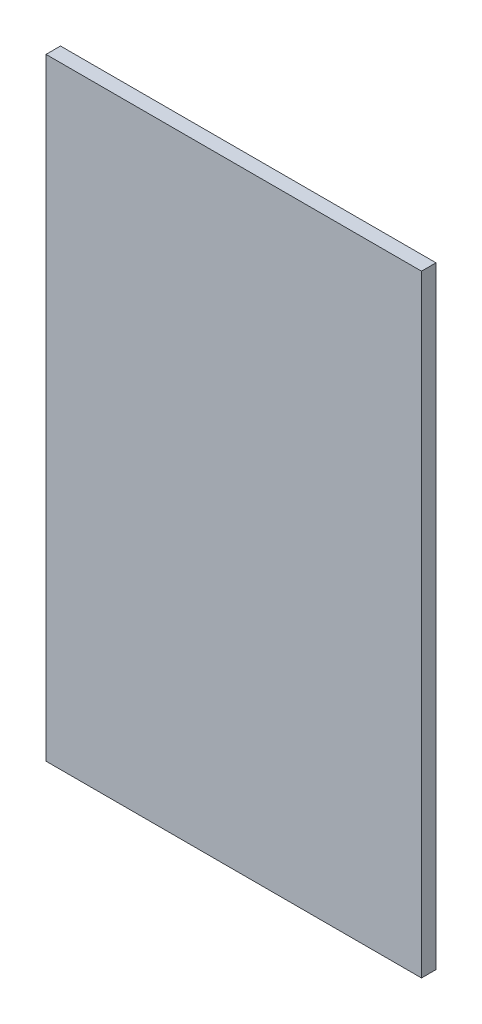
ISO-10303-21;
HEADER;
FILE_DESCRIPTION(('STEP AP214'),'2;1');
FILE_NAME('part.step','',(''),(''),'','','');
FILE_SCHEMA(('AUTOMOTIVE_DESIGN { 1 0 10303 214 1 1 1 1 }'));
ENDSEC;
DATA;
#1=APPLICATION_CONTEXT('core data for automotive mechanical design processes');
#2=APPLICATION_PROTOCOL_DEFINITION('international standard','automotive_design',2000,#1);
#3=PRODUCT_CONTEXT('',#1,'mechanical');
#4=PRODUCT('Part','Part','',(#3));
#5=PRODUCT_RELATED_PRODUCT_CATEGORY('part','',(#4));
#6=PRODUCT_DEFINITION_FORMATION('','',#4);
#7=PRODUCT_DEFINITION_CONTEXT('part definition',#1,'design');
#8=PRODUCT_DEFINITION('design','',#6,#7);
#9=PRODUCT_DEFINITION_SHAPE('','',#8);
#10=(LENGTH_UNIT() NAMED_UNIT(*) SI_UNIT(.MILLI.,.METRE.));
#11=(NAMED_UNIT(*) PLANE_ANGLE_UNIT() SI_UNIT($,.RADIAN.));
#12=(NAMED_UNIT(*) SI_UNIT($,.STERADIAN.) SOLID_ANGLE_UNIT());
#13=UNCERTAINTY_MEASURE_WITH_UNIT(LENGTH_MEASURE(1.E-05),#10,'distance_accuracy_value','');
#14=(GEOMETRIC_REPRESENTATION_CONTEXT(3) GLOBAL_UNCERTAINTY_ASSIGNED_CONTEXT((#13)) GLOBAL_UNIT_ASSIGNED_CONTEXT((#10,
#11,#12)) REPRESENTATION_CONTEXT('',''));
#15=CARTESIAN_POINT('',(0.,0.,0.));
#16=DIRECTION('',(0.,0.,1.));
#17=DIRECTION('',(1.,0.,0.));
#18=AXIS2_PLACEMENT_3D('',#15,#16,#17);
#19=CARTESIAN_POINT('',(13.24356,7.239,2.39395));
#20=DIRECTION('',(0.,0.,-1.));
#21=DIRECTION('',(-1.,0.,0.));
#22=AXIS2_PLACEMENT_3D('',#19,#20,#21);
#23=PLANE('',#22);
#24=DIRECTION('',(0.,1.,0.));
#25=VECTOR('',#24,1.);
#26=CARTESIAN_POINT('',(-13.24356,28.829,2.39395));
#27=LINE('',#26,#25);
#28=CARTESIAN_POINT('',(-13.24356,7.239,2.39395));
#29=VERTEX_POINT('',#28);
#30=CARTESIAN_POINT('',(-13.24356,50.419,2.39395));
#31=VERTEX_POINT('',#30);
#32=EDGE_CURVE('E21',#29,#31,#27,.T.);
#33=ORIENTED_EDGE('',*,*,#32,.F.);
#34=DIRECTION('',(-1.,0.,0.));
#35=VECTOR('',#34,1.);
#36=CARTESIAN_POINT('',(0.,7.239,2.39395));
#37=LINE('',#36,#35);
#38=CARTESIAN_POINT('',(13.24356,7.239,2.39395));
#39=VERTEX_POINT('',#38);
#40=EDGE_CURVE('E27',#39,#29,#37,.T.);
#41=ORIENTED_EDGE('',*,*,#40,.F.);
#42=DIRECTION('',(0.,-1.,0.));
#43=VECTOR('',#42,1.);
#44=CARTESIAN_POINT('',(13.24356,28.829,2.39395));
#45=LINE('',#44,#43);
#46=CARTESIAN_POINT('',(13.24356,50.419,2.39395));
#47=VERTEX_POINT('',#46);
#48=EDGE_CURVE('E67',#47,#39,#45,.T.);
#49=ORIENTED_EDGE('',*,*,#48,.F.);
#50=DIRECTION('',(1.,0.,0.));
#51=VECTOR('',#50,1.);
#52=CARTESIAN_POINT('',(0.,50.419,2.39395));
#53=LINE('',#52,#51);
#54=EDGE_CURVE('E70',#31,#47,#53,.T.);
#55=ORIENTED_EDGE('',*,*,#54,.F.);
#56=EDGE_LOOP('',(#33,#41,#49,#55));
#57=FACE_BOUND('',#56,.T.);
#58=ADVANCED_FACE('F17',(#57),#23,.F.);
#59=CARTESIAN_POINT('',(13.24356,7.239,1.3716));
#60=DIRECTION('',(0.,0.,-1.));
#61=DIRECTION('',(-1.,0.,0.));
#62=AXIS2_PLACEMENT_3D('',#59,#60,#61);
#63=PLANE('',#62);
#64=DIRECTION('',(0.,1.,0.));
#65=VECTOR('',#64,1.);
#66=CARTESIAN_POINT('',(-13.24356,28.829,1.3716));
#67=LINE('',#66,#65);
#68=CARTESIAN_POINT('',(-13.24356,7.239,1.3716));
#69=VERTEX_POINT('',#68);
#70=CARTESIAN_POINT('',(-13.24356,50.419,1.3716));
#71=VERTEX_POINT('',#70);
#72=EDGE_CURVE('E98',#69,#71,#67,.T.);
#73=ORIENTED_EDGE('',*,*,#72,.T.);
#74=DIRECTION('',(1.,0.,0.));
#75=VECTOR('',#74,1.);
#76=CARTESIAN_POINT('',(0.,50.419,1.3716));
#77=LINE('',#76,#75);
#78=CARTESIAN_POINT('',(13.24356,50.419,1.3716));
#79=VERTEX_POINT('',#78);
#80=EDGE_CURVE('E76',#71,#79,#77,.T.);
#81=ORIENTED_EDGE('',*,*,#80,.T.);
#82=DIRECTION('',(0.,-1.,0.));
#83=VECTOR('',#82,1.);
#84=CARTESIAN_POINT('',(13.24356,28.829,1.3716));
#85=LINE('',#84,#83);
#86=CARTESIAN_POINT('',(13.24356,7.239,1.3716));
#87=VERTEX_POINT('',#86);
#88=EDGE_CURVE('E81',#79,#87,#85,.T.);
#89=ORIENTED_EDGE('',*,*,#88,.T.);
#90=DIRECTION('',(-1.,0.,0.));
#91=VECTOR('',#90,1.);
#92=CARTESIAN_POINT('',(0.,7.239,1.3716));
#93=LINE('',#92,#91);
#94=EDGE_CURVE('E11',#87,#69,#93,.T.);
#95=ORIENTED_EDGE('',*,*,#94,.T.);
#96=EDGE_LOOP('',(#73,#81,#89,#95));
#97=FACE_BOUND('',#96,.T.);
#98=ADVANCED_FACE('F129',(#97),#63,.T.);
#99=CARTESIAN_POINT('',(13.24356,7.239,1.3716));
#100=DIRECTION('',(0.,1.,0.));
#101=DIRECTION('',(-1.,0.,0.));
#102=AXIS2_PLACEMENT_3D('',#99,#100,#101);
#103=PLANE('',#102);
#104=ORIENTED_EDGE('',*,*,#40,.T.);
#105=DIRECTION('',(0.,0.,1.));
#106=VECTOR('',#105,1.);
#107=CARTESIAN_POINT('',(-13.24356,7.239,1.882775));
#108=LINE('',#107,#106);
#109=EDGE_CURVE('E91',#69,#29,#108,.T.);
#110=ORIENTED_EDGE('',*,*,#109,.F.);
#111=ORIENTED_EDGE('',*,*,#94,.F.);
#112=DIRECTION('',(0.,0.,1.));
#113=VECTOR('',#112,1.);
#114=CARTESIAN_POINT('',(13.24356,7.239,1.882775));
#115=LINE('',#114,#113);
#116=EDGE_CURVE('E75',#87,#39,#115,.T.);
#117=ORIENTED_EDGE('',*,*,#116,.T.);
#118=EDGE_LOOP('',(#104,#110,#111,#117));
#119=FACE_BOUND('',#118,.T.);
#120=ADVANCED_FACE('F116',(#119),#103,.F.);
#121=CARTESIAN_POINT('',(13.24356,50.419,1.3716));
#122=DIRECTION('',(-1.,0.,0.));
#123=DIRECTION('',(0.,-1.,0.));
#124=AXIS2_PLACEMENT_3D('',#121,#122,#123);
#125=PLANE('',#124);
#126=ORIENTED_EDGE('',*,*,#48,.T.);
#127=ORIENTED_EDGE('',*,*,#116,.F.);
#128=ORIENTED_EDGE('',*,*,#88,.F.);
#129=DIRECTION('',(0.,0.,1.));
#130=VECTOR('',#129,1.);
#131=CARTESIAN_POINT('',(13.24356,50.419,1.882775));
#132=LINE('',#131,#130);
#133=EDGE_CURVE('E79',#79,#47,#132,.T.);
#134=ORIENTED_EDGE('',*,*,#133,.T.);
#135=EDGE_LOOP('',(#126,#127,#128,#134));
#136=FACE_BOUND('',#135,.T.);
#137=ADVANCED_FACE('F80',(#136),#125,.F.);
#138=CARTESIAN_POINT('',(-13.24356,50.419,1.3716));
#139=DIRECTION('',(0.,-1.,0.));
#140=DIRECTION('',(1.,0.,0.));
#141=AXIS2_PLACEMENT_3D('',#138,#139,#140);
#142=PLANE('',#141);
#143=ORIENTED_EDGE('',*,*,#54,.T.);
#144=ORIENTED_EDGE('',*,*,#133,.F.);
#145=ORIENTED_EDGE('',*,*,#80,.F.);
#146=DIRECTION('',(0.,0.,1.));
#147=VECTOR('',#146,1.);
#148=CARTESIAN_POINT('',(-13.24356,50.419,1.882775));
#149=LINE('',#148,#147);
#150=EDGE_CURVE('E88',#71,#31,#149,.T.);
#151=ORIENTED_EDGE('',*,*,#150,.T.);
#152=EDGE_LOOP('',(#143,#144,#145,#151));
#153=FACE_BOUND('',#152,.T.);
#154=ADVANCED_FACE('F86',(#153),#142,.F.);
#155=CARTESIAN_POINT('',(-13.24356,7.239,2.39395));
#156=DIRECTION('',(1.,0.,0.));
#157=DIRECTION('',(0.,0.,-1.));
#158=AXIS2_PLACEMENT_3D('',#155,#156,#157);
#159=PLANE('',#158);
#160=ORIENTED_EDGE('',*,*,#32,.T.);
#161=ORIENTED_EDGE('',*,*,#150,.F.);
#162=ORIENTED_EDGE('',*,*,#72,.F.);
#163=ORIENTED_EDGE('',*,*,#109,.T.);
#164=EDGE_LOOP('',(#160,#161,#162,#163));
#165=FACE_BOUND('',#164,.T.);
#166=ADVANCED_FACE('F19',(#165),#159,.F.);
#167=CLOSED_SHELL('',(#58,#98,#120,#137,#154,#166));
#168=MANIFOLD_SOLID_BREP('B1',#167);
#169=ADVANCED_BREP_SHAPE_REPRESENTATION('',(#18,#168),#14);
#170=SHAPE_DEFINITION_REPRESENTATION(#9,#169);
ENDSEC;
END-ISO-10303-21;
